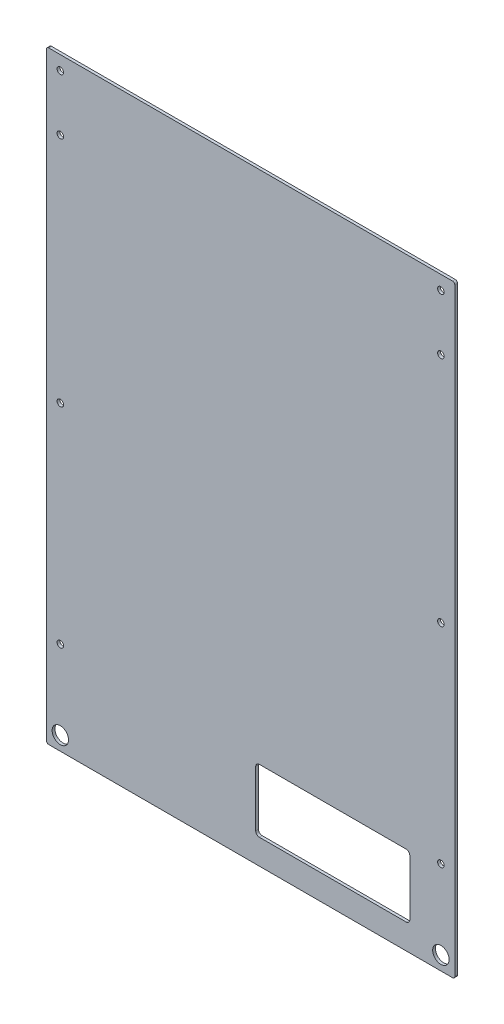
ISO-10303-21;
HEADER;
FILE_DESCRIPTION(('STEP AP214'),'2;1');
FILE_NAME('part.step','',(''),(''),'','','');
FILE_SCHEMA(('AUTOMOTIVE_DESIGN { 1 0 10303 214 1 1 1 1 }'));
ENDSEC;
DATA;
#1=APPLICATION_CONTEXT('core data for automotive mechanical design processes');
#2=APPLICATION_PROTOCOL_DEFINITION('international standard','automotive_design',2000,#1);
#3=PRODUCT_CONTEXT('',#1,'mechanical');
#4=PRODUCT('Part','Part','',(#3));
#5=PRODUCT_RELATED_PRODUCT_CATEGORY('part','',(#4));
#6=PRODUCT_DEFINITION_FORMATION('','',#4);
#7=PRODUCT_DEFINITION_CONTEXT('part definition',#1,'design');
#8=PRODUCT_DEFINITION('design','',#6,#7);
#9=PRODUCT_DEFINITION_SHAPE('','',#8);
#10=(LENGTH_UNIT() NAMED_UNIT(*) SI_UNIT(.MILLI.,.METRE.));
#11=(NAMED_UNIT(*) PLANE_ANGLE_UNIT() SI_UNIT($,.RADIAN.));
#12=(NAMED_UNIT(*) SI_UNIT($,.STERADIAN.) SOLID_ANGLE_UNIT());
#13=UNCERTAINTY_MEASURE_WITH_UNIT(LENGTH_MEASURE(1.E-05),#10,'distance_accuracy_value','');
#14=(GEOMETRIC_REPRESENTATION_CONTEXT(3) GLOBAL_UNCERTAINTY_ASSIGNED_CONTEXT((#13)) GLOBAL_UNIT_ASSIGNED_CONTEXT((#10,
#11,#12)) REPRESENTATION_CONTEXT('',''));
#15=CARTESIAN_POINT('',(0.,0.,0.));
#16=DIRECTION('',(0.,0.,1.));
#17=DIRECTION('',(1.,0.,0.));
#18=AXIS2_PLACEMENT_3D('',#15,#16,#17);
#19=CARTESIAN_POINT('',(0.,0.,3.));
#20=DIRECTION('',(0.,0.,1.));
#21=DIRECTION('',(1.,0.,0.));
#22=AXIS2_PLACEMENT_3D('',#19,#20,#21);
#23=PLANE('',#22);
#24=CARTESIAN_POINT('',(205.,-310.,3.));
#25=DIRECTION('',(0.,0.,-1.));
#26=DIRECTION('',(1.,0.,0.));
#27=AXIS2_PLACEMENT_3D('',#24,#25,#26);
#28=CIRCLE('',#27,8.85);
#29=CARTESIAN_POINT('',(196.15,-310.,3.));
#30=VERTEX_POINT('',#29);
#31=EDGE_CURVE('E321',#30,#30,#28,.T.);
#32=ORIENTED_EDGE('',*,*,#31,.T.);
#33=EDGE_LOOP('',(#32));
#34=FACE_BOUND('',#33,.T.);
#35=CARTESIAN_POINT('',(-205.,-310.,3.));
#36=DIRECTION('',(0.,0.,-1.));
#37=DIRECTION('',(1.,0.,0.));
#38=AXIS2_PLACEMENT_3D('',#35,#36,#37);
#39=CIRCLE('',#38,8.85);
#40=CARTESIAN_POINT('',(-213.85,-310.,3.));
#41=VERTEX_POINT('',#40);
#42=EDGE_CURVE('E366',#41,#41,#39,.T.);
#43=ORIENTED_EDGE('',*,*,#42,.T.);
#44=EDGE_LOOP('',(#43));
#45=FACE_BOUND('',#44,.T.);
#46=DIRECTION('',(-1.,0.,0.));
#47=VECTOR('',#46,1.);
#48=CARTESIAN_POINT('',(83.75,-298.,3.));
#49=LINE('',#48,#47);
#50=CARTESIAN_POINT('',(167.5,-298.,3.));
#51=VERTEX_POINT('',#50);
#52=CARTESIAN_POINT('',(9.5,-298.,3.));
#53=VERTEX_POINT('',#52);
#54=EDGE_CURVE('E411',#51,#53,#49,.T.);
#55=ORIENTED_EDGE('',*,*,#54,.T.);
#56=CARTESIAN_POINT('',(9.5,-294.,3.));
#57=DIRECTION('',(0.,0.,-1.));
#58=DIRECTION('',(-1.,0.,0.));
#59=AXIS2_PLACEMENT_3D('',#56,#57,#58);
#60=CIRCLE('',#59,4.);
#61=CARTESIAN_POINT('',(5.5,-294.,3.));
#62=VERTEX_POINT('',#61);
#63=EDGE_CURVE('E300',#53,#62,#60,.T.);
#64=ORIENTED_EDGE('',*,*,#63,.T.);
#65=DIRECTION('',(0.,1.,0.));
#66=VECTOR('',#65,1.);
#67=CARTESIAN_POINT('',(5.5,-147.,3.));
#68=LINE('',#67,#66);
#69=CARTESIAN_POINT('',(5.5,-234.,3.));
#70=VERTEX_POINT('',#69);
#71=EDGE_CURVE('E301',#62,#70,#68,.T.);
#72=ORIENTED_EDGE('',*,*,#71,.T.);
#73=CARTESIAN_POINT('',(9.5,-234.,3.));
#74=DIRECTION('',(0.,0.,-1.));
#75=DIRECTION('',(0.,1.,0.));
#76=AXIS2_PLACEMENT_3D('',#73,#74,#75);
#77=CIRCLE('',#76,4.);
#78=CARTESIAN_POINT('',(9.5,-230.,3.));
#79=VERTEX_POINT('',#78);
#80=EDGE_CURVE('E357',#70,#79,#77,.T.);
#81=ORIENTED_EDGE('',*,*,#80,.T.);
#82=DIRECTION('',(1.,0.,0.));
#83=VECTOR('',#82,1.);
#84=CARTESIAN_POINT('',(4.75,-230.,3.));
#85=LINE('',#84,#83);
#86=CARTESIAN_POINT('',(167.5,-230.,3.));
#87=VERTEX_POINT('',#86);
#88=EDGE_CURVE('E287',#79,#87,#85,.T.);
#89=ORIENTED_EDGE('',*,*,#88,.T.);
#90=CARTESIAN_POINT('',(167.5,-234.,3.));
#91=DIRECTION('',(0.,0.,-1.));
#92=DIRECTION('',(1.,0.,0.));
#93=AXIS2_PLACEMENT_3D('',#90,#91,#92);
#94=CIRCLE('',#93,4.);
#95=CARTESIAN_POINT('',(171.5,-234.,3.));
#96=VERTEX_POINT('',#95);
#97=EDGE_CURVE('E318',#87,#96,#94,.T.);
#98=ORIENTED_EDGE('',*,*,#97,.T.);
#99=DIRECTION('',(0.,-1.,0.));
#100=VECTOR('',#99,1.);
#101=CARTESIAN_POINT('',(171.5,-117.,3.));
#102=LINE('',#101,#100);
#103=CARTESIAN_POINT('',(171.5,-294.,3.));
#104=VERTEX_POINT('',#103);
#105=EDGE_CURVE('E449',#96,#104,#102,.T.);
#106=ORIENTED_EDGE('',*,*,#105,.T.);
#107=CARTESIAN_POINT('',(167.5,-294.,3.));
#108=DIRECTION('',(0.,0.,-1.));
#109=DIRECTION('',(0.,-1.,0.));
#110=AXIS2_PLACEMENT_3D('',#107,#108,#109);
#111=CIRCLE('',#110,4.);
#112=EDGE_CURVE('E395',#104,#51,#111,.T.);
#113=ORIENTED_EDGE('',*,*,#112,.T.);
#114=EDGE_LOOP('',(#55,#64,#72,#81,#89,#98,#106,#113));
#115=FACE_BOUND('',#114,.T.);
#116=CARTESIAN_POINT('',(205.,310.,3.));
#117=DIRECTION('',(0.,0.,-1.));
#118=DIRECTION('',(-1.,0.,0.));
#119=AXIS2_PLACEMENT_3D('',#116,#117,#118);
#120=CIRCLE('',#119,3.5);
#121=CARTESIAN_POINT('',(208.5,310.,3.));
#122=VERTEX_POINT('',#121);
#123=EDGE_CURVE('E372',#122,#122,#120,.T.);
#124=ORIENTED_EDGE('',*,*,#123,.T.);
#125=EDGE_LOOP('',(#124));
#126=FACE_BOUND('',#125,.T.);
#127=CARTESIAN_POINT('',(-205.,250.,3.));
#128=DIRECTION('',(0.,0.,-1.));
#129=DIRECTION('',(-1.,0.,0.));
#130=AXIS2_PLACEMENT_3D('',#127,#128,#129);
#131=CIRCLE('',#130,3.5);
#132=CARTESIAN_POINT('',(-201.5,250.,3.));
#133=VERTEX_POINT('',#132);
#134=EDGE_CURVE('E310',#133,#133,#131,.T.);
#135=ORIENTED_EDGE('',*,*,#134,.T.);
#136=EDGE_LOOP('',(#135));
#137=FACE_BOUND('',#136,.T.);
#138=CARTESIAN_POINT('',(205.,-225.,3.));
#139=DIRECTION('',(0.,0.,-1.));
#140=DIRECTION('',(-1.,0.,0.));
#141=AXIS2_PLACEMENT_3D('',#138,#139,#140);
#142=CIRCLE('',#141,3.5);
#143=CARTESIAN_POINT('',(208.5,-225.,3.));
#144=VERTEX_POINT('',#143);
#145=EDGE_CURVE('E356',#144,#144,#142,.T.);
#146=ORIENTED_EDGE('',*,*,#145,.T.);
#147=EDGE_LOOP('',(#146));
#148=FACE_BOUND('',#147,.T.);
#149=CARTESIAN_POINT('',(-205.,0.,3.));
#150=DIRECTION('',(0.,0.,-1.));
#151=DIRECTION('',(-1.,0.,0.));
#152=AXIS2_PLACEMENT_3D('',#149,#150,#151);
#153=CIRCLE('',#152,3.5);
#154=CARTESIAN_POINT('',(-201.5,0.,3.));
#155=VERTEX_POINT('',#154);
#156=EDGE_CURVE('E305',#155,#155,#153,.T.);
#157=ORIENTED_EDGE('',*,*,#156,.T.);
#158=EDGE_LOOP('',(#157));
#159=FACE_BOUND('',#158,.T.);
#160=CARTESIAN_POINT('',(-205.,310.,3.));
#161=DIRECTION('',(0.,0.,-1.));
#162=DIRECTION('',(-1.,0.,0.));
#163=AXIS2_PLACEMENT_3D('',#160,#161,#162);
#164=CIRCLE('',#163,3.5);
#165=CARTESIAN_POINT('',(-201.5,310.,3.));
#166=VERTEX_POINT('',#165);
#167=EDGE_CURVE('E461',#166,#166,#164,.T.);
#168=ORIENTED_EDGE('',*,*,#167,.T.);
#169=EDGE_LOOP('',(#168));
#170=FACE_BOUND('',#169,.T.);
#171=CARTESIAN_POINT('',(205.,250.,3.));
#172=DIRECTION('',(0.,0.,-1.));
#173=DIRECTION('',(-1.,0.,0.));
#174=AXIS2_PLACEMENT_3D('',#171,#172,#173);
#175=CIRCLE('',#174,3.5);
#176=CARTESIAN_POINT('',(208.5,250.,3.));
#177=VERTEX_POINT('',#176);
#178=EDGE_CURVE('E387',#177,#177,#175,.T.);
#179=ORIENTED_EDGE('',*,*,#178,.T.);
#180=EDGE_LOOP('',(#179));
#181=FACE_BOUND('',#180,.T.);
#182=CARTESIAN_POINT('',(205.,0.,3.));
#183=DIRECTION('',(0.,0.,-1.));
#184=DIRECTION('',(-1.,0.,0.));
#185=AXIS2_PLACEMENT_3D('',#182,#183,#184);
#186=CIRCLE('',#185,3.5);
#187=CARTESIAN_POINT('',(208.5,0.,3.));
#188=VERTEX_POINT('',#187);
#189=EDGE_CURVE('E317',#188,#188,#186,.T.);
#190=ORIENTED_EDGE('',*,*,#189,.T.);
#191=EDGE_LOOP('',(#190));
#192=FACE_BOUND('',#191,.T.);
#193=CARTESIAN_POINT('',(-205.,-225.,3.));
#194=DIRECTION('',(0.,0.,-1.));
#195=DIRECTION('',(-1.,0.,0.));
#196=AXIS2_PLACEMENT_3D('',#193,#194,#195);
#197=CIRCLE('',#196,3.5);
#198=CARTESIAN_POINT('',(-201.5,-225.,3.));
#199=VERTEX_POINT('',#198);
#200=EDGE_CURVE('E336',#199,#199,#197,.T.);
#201=ORIENTED_EDGE('',*,*,#200,.T.);
#202=EDGE_LOOP('',(#201));
#203=FACE_BOUND('',#202,.T.);
#204=CARTESIAN_POINT('',(217.5,322.5,3.));
#205=DIRECTION('',(0.,0.,-1.));
#206=DIRECTION('',(0.707106781186548,0.707106781186548,0.));
#207=AXIS2_PLACEMENT_3D('',#204,#205,#206);
#208=CIRCLE('',#207,2.5);
#209=CARTESIAN_POINT('',(217.5,325.,3.));
#210=VERTEX_POINT('',#209);
#211=CARTESIAN_POINT('',(220.,322.5,3.));
#212=VERTEX_POINT('',#211);
#213=EDGE_CURVE('E390',#210,#212,#208,.T.);
#214=ORIENTED_EDGE('',*,*,#213,.F.);
#215=DIRECTION('',(-1.,0.,0.));
#216=VECTOR('',#215,1.);
#217=CARTESIAN_POINT('',(-220.,325.,3.));
#218=LINE('',#217,#216);
#219=CARTESIAN_POINT('',(-217.5,325.,3.));
#220=VERTEX_POINT('',#219);
#221=EDGE_CURVE('E426',#210,#220,#218,.T.);
#222=ORIENTED_EDGE('',*,*,#221,.T.);
#223=CARTESIAN_POINT('',(-217.5,322.5,3.));
#224=DIRECTION('',(0.,0.,-1.));
#225=DIRECTION('',(-0.707106781186548,0.707106781186548,0.));
#226=AXIS2_PLACEMENT_3D('',#223,#224,#225);
#227=CIRCLE('',#226,2.5);
#228=CARTESIAN_POINT('',(-220.,322.5,3.));
#229=VERTEX_POINT('',#228);
#230=EDGE_CURVE('E247',#229,#220,#227,.T.);
#231=ORIENTED_EDGE('',*,*,#230,.F.);
#232=DIRECTION('',(0.,-1.,0.));
#233=VECTOR('',#232,1.);
#234=CARTESIAN_POINT('',(-220.,-325.,3.));
#235=LINE('',#234,#233);
#236=CARTESIAN_POINT('',(-220.,-322.5,3.));
#237=VERTEX_POINT('',#236);
#238=EDGE_CURVE('E242',#229,#237,#235,.T.);
#239=ORIENTED_EDGE('',*,*,#238,.T.);
#240=CARTESIAN_POINT('',(-217.5,-322.5,3.));
#241=DIRECTION('',(0.,0.,-1.));
#242=DIRECTION('',(-0.707106781186548,-0.707106781186548,0.));
#243=AXIS2_PLACEMENT_3D('',#240,#241,#242);
#244=CIRCLE('',#243,2.5);
#245=CARTESIAN_POINT('',(-217.5,-325.,3.));
#246=VERTEX_POINT('',#245);
#247=EDGE_CURVE('E363',#246,#237,#244,.T.);
#248=ORIENTED_EDGE('',*,*,#247,.F.);
#249=DIRECTION('',(1.,0.,0.));
#250=VECTOR('',#249,1.);
#251=CARTESIAN_POINT('',(220.,-325.,3.));
#252=LINE('',#251,#250);
#253=CARTESIAN_POINT('',(217.5,-325.,3.));
#254=VERTEX_POINT('',#253);
#255=EDGE_CURVE('E394',#246,#254,#252,.T.);
#256=ORIENTED_EDGE('',*,*,#255,.T.);
#257=CARTESIAN_POINT('',(217.5,-322.5,3.));
#258=DIRECTION('',(0.,0.,-1.));
#259=DIRECTION('',(0.707106781186548,-0.707106781186548,0.));
#260=AXIS2_PLACEMENT_3D('',#257,#258,#259);
#261=CIRCLE('',#260,2.5);
#262=CARTESIAN_POINT('',(220.,-322.5,3.));
#263=VERTEX_POINT('',#262);
#264=EDGE_CURVE('E286',#263,#254,#261,.T.);
#265=ORIENTED_EDGE('',*,*,#264,.F.);
#266=DIRECTION('',(0.,1.,0.));
#267=VECTOR('',#266,1.);
#268=CARTESIAN_POINT('',(220.,325.,3.));
#269=LINE('',#268,#267);
#270=EDGE_CURVE('E10',#263,#212,#269,.T.);
#271=ORIENTED_EDGE('',*,*,#270,.T.);
#272=EDGE_LOOP('',(#214,#222,#231,#239,#248,#256,#265,#271));
#273=FACE_BOUND('',#272,.T.);
#274=ADVANCED_FACE('F15',(#34,#45,#115,#126,#137,#148,#159,#170,#181,#192,#203,#273),#23,.T.);
#275=CARTESIAN_POINT('',(220.,-325.,0.));
#276=DIRECTION('',(1.,0.,0.));
#277=DIRECTION('',(0.,1.,0.));
#278=AXIS2_PLACEMENT_3D('',#275,#276,#277);
#279=PLANE('',#278);
#280=DIRECTION('',(0.,0.,-1.));
#281=VECTOR('',#280,1.);
#282=CARTESIAN_POINT('',(220.,322.5,0.));
#283=LINE('',#282,#281);
#284=CARTESIAN_POINT('',(220.,322.5,0.));
#285=VERTEX_POINT('',#284);
#286=EDGE_CURVE('E425',#212,#285,#283,.T.);
#287=ORIENTED_EDGE('',*,*,#286,.F.);
#288=ORIENTED_EDGE('',*,*,#270,.F.);
#289=DIRECTION('',(0.,0.,1.));
#290=VECTOR('',#289,1.);
#291=CARTESIAN_POINT('',(220.,-322.5,0.));
#292=LINE('',#291,#290);
#293=CARTESIAN_POINT('',(220.,-322.5,0.));
#294=VERTEX_POINT('',#293);
#295=EDGE_CURVE('E282',#294,#263,#292,.T.);
#296=ORIENTED_EDGE('',*,*,#295,.F.);
#297=DIRECTION('',(0.,-1.,0.));
#298=VECTOR('',#297,1.);
#299=CARTESIAN_POINT('',(220.,325.,0.));
#300=LINE('',#299,#298);
#301=EDGE_CURVE('E430',#285,#294,#300,.T.);
#302=ORIENTED_EDGE('',*,*,#301,.F.);
#303=EDGE_LOOP('',(#287,#288,#296,#302));
#304=FACE_BOUND('',#303,.T.);
#305=ADVANCED_FACE('F761',(#304),#279,.T.);
#306=CARTESIAN_POINT('',(-205.,-310.,0.));
#307=DIRECTION('',(0.,0.,1.));
#308=DIRECTION('',(1.,0.,0.));
#309=AXIS2_PLACEMENT_3D('',#306,#307,#308);
#310=CYLINDRICAL_SURFACE('',#309,8.85);
#311=ORIENTED_EDGE('',*,*,#42,.F.);
#312=DIRECTION('',(0.,0.,-1.));
#313=VECTOR('',#312,1.);
#314=CARTESIAN_POINT('',(-213.85,-310.,0.));
#315=LINE('',#314,#313);
#316=CARTESIAN_POINT('',(-213.85,-310.,0.));
#317=VERTEX_POINT('',#316);
#318=EDGE_CURVE('E26',#41,#317,#315,.T.);
#319=ORIENTED_EDGE('',*,*,#318,.T.);
#320=CARTESIAN_POINT('',(-205.,-310.,0.));
#321=DIRECTION('',(0.,0.,-1.));
#322=DIRECTION('',(1.,0.,0.));
#323=AXIS2_PLACEMENT_3D('',#320,#321,#322);
#324=CIRCLE('',#323,8.85);
#325=EDGE_CURVE('E376',#317,#317,#324,.T.);
#326=ORIENTED_EDGE('',*,*,#325,.T.);
#327=ORIENTED_EDGE('',*,*,#318,.F.);
#328=EDGE_LOOP('',(#311,#319,#326,#327));
#329=FACE_BOUND('',#328,.T.);
#330=ADVANCED_FACE('F726',(#329),#310,.F.);
#331=CARTESIAN_POINT('',(205.,-310.,0.));
#332=DIRECTION('',(0.,0.,1.));
#333=DIRECTION('',(1.,0.,0.));
#334=AXIS2_PLACEMENT_3D('',#331,#332,#333);
#335=CYLINDRICAL_SURFACE('',#334,8.85);
#336=ORIENTED_EDGE('',*,*,#31,.F.);
#337=DIRECTION('',(0.,0.,-1.));
#338=VECTOR('',#337,1.);
#339=CARTESIAN_POINT('',(196.15,-310.,0.));
#340=LINE('',#339,#338);
#341=CARTESIAN_POINT('',(196.15,-310.,0.));
#342=VERTEX_POINT('',#341);
#343=EDGE_CURVE('E421',#30,#342,#340,.T.);
#344=ORIENTED_EDGE('',*,*,#343,.T.);
#345=CARTESIAN_POINT('',(205.,-310.,0.));
#346=DIRECTION('',(0.,0.,-1.));
#347=DIRECTION('',(1.,0.,0.));
#348=AXIS2_PLACEMENT_3D('',#345,#346,#347);
#349=CIRCLE('',#348,8.85);
#350=EDGE_CURVE('E330',#342,#342,#349,.T.);
#351=ORIENTED_EDGE('',*,*,#350,.T.);
#352=ORIENTED_EDGE('',*,*,#343,.F.);
#353=EDGE_LOOP('',(#336,#344,#351,#352));
#354=FACE_BOUND('',#353,.T.);
#355=ADVANCED_FACE('F721',(#354),#335,.F.);
#356=CARTESIAN_POINT('',(167.5,-234.,3.));
#357=DIRECTION('',(0.,0.,-1.));
#358=DIRECTION('',(1.,0.,0.));
#359=AXIS2_PLACEMENT_3D('',#356,#357,#358);
#360=CYLINDRICAL_SURFACE('',#359,4.);
#361=CARTESIAN_POINT('',(167.5,-234.,0.));
#362=DIRECTION('',(0.,0.,1.));
#363=DIRECTION('',(1.,0.,0.));
#364=AXIS2_PLACEMENT_3D('',#361,#362,#363);
#365=CIRCLE('',#364,4.);
#366=CARTESIAN_POINT('',(171.5,-234.,0.));
#367=VERTEX_POINT('',#366);
#368=CARTESIAN_POINT('',(167.5,-230.,0.));
#369=VERTEX_POINT('',#368);
#370=EDGE_CURVE('E295',#367,#369,#365,.T.);
#371=ORIENTED_EDGE('',*,*,#370,.F.);
#372=DIRECTION('',(0.,0.,-1.));
#373=VECTOR('',#372,1.);
#374=CARTESIAN_POINT('',(171.5,-234.,3.));
#375=LINE('',#374,#373);
#376=EDGE_CURVE('E211',#96,#367,#375,.T.);
#377=ORIENTED_EDGE('',*,*,#376,.F.);
#378=ORIENTED_EDGE('',*,*,#97,.F.);
#379=DIRECTION('',(0.,0.,-1.));
#380=VECTOR('',#379,1.);
#381=CARTESIAN_POINT('',(167.5,-230.,3.));
#382=LINE('',#381,#380);
#383=EDGE_CURVE('E200',#87,#369,#382,.T.);
#384=ORIENTED_EDGE('',*,*,#383,.T.);
#385=EDGE_LOOP('',(#371,#377,#378,#384));
#386=FACE_BOUND('',#385,.T.);
#387=ADVANCED_FACE('F725',(#386),#360,.F.);
#388=CARTESIAN_POINT('',(171.5,-234.,3.));
#389=DIRECTION('',(1.,0.,0.));
#390=DIRECTION('',(0.,1.,0.));
#391=AXIS2_PLACEMENT_3D('',#388,#389,#390);
#392=PLANE('',#391);
#393=DIRECTION('',(0.,1.,0.));
#394=VECTOR('',#393,1.);
#395=CARTESIAN_POINT('',(171.5,-117.,0.));
#396=LINE('',#395,#394);
#397=CARTESIAN_POINT('',(171.5,-294.,0.));
#398=VERTEX_POINT('',#397);
#399=EDGE_CURVE('E291',#398,#367,#396,.T.);
#400=ORIENTED_EDGE('',*,*,#399,.F.);
#401=DIRECTION('',(0.,0.,-1.));
#402=VECTOR('',#401,1.);
#403=CARTESIAN_POINT('',(171.5,-294.,3.));
#404=LINE('',#403,#402);
#405=EDGE_CURVE('E398',#104,#398,#404,.T.);
#406=ORIENTED_EDGE('',*,*,#405,.F.);
#407=ORIENTED_EDGE('',*,*,#105,.F.);
#408=ORIENTED_EDGE('',*,*,#376,.T.);
#409=EDGE_LOOP('',(#400,#406,#407,#408));
#410=FACE_BOUND('',#409,.T.);
#411=ADVANCED_FACE('F778',(#410),#392,.F.);
#412=CARTESIAN_POINT('',(167.5,-294.,3.));
#413=DIRECTION('',(0.,0.,-1.));
#414=DIRECTION('',(0.,-1.,0.));
#415=AXIS2_PLACEMENT_3D('',#412,#413,#414);
#416=CYLINDRICAL_SURFACE('',#415,4.);
#417=CARTESIAN_POINT('',(167.5,-294.,0.));
#418=DIRECTION('',(0.,0.,1.));
#419=DIRECTION('',(0.,-1.,0.));
#420=AXIS2_PLACEMENT_3D('',#417,#418,#419);
#421=CIRCLE('',#420,4.);
#422=CARTESIAN_POINT('',(167.5,-298.,0.));
#423=VERTEX_POINT('',#422);
#424=EDGE_CURVE('E296',#423,#398,#421,.T.);
#425=ORIENTED_EDGE('',*,*,#424,.F.);
#426=DIRECTION('',(0.,0.,-1.));
#427=VECTOR('',#426,1.);
#428=CARTESIAN_POINT('',(167.5,-298.,3.));
#429=LINE('',#428,#427);
#430=EDGE_CURVE('E399',#51,#423,#429,.T.);
#431=ORIENTED_EDGE('',*,*,#430,.F.);
#432=ORIENTED_EDGE('',*,*,#112,.F.);
#433=ORIENTED_EDGE('',*,*,#405,.T.);
#434=EDGE_LOOP('',(#425,#431,#432,#433));
#435=FACE_BOUND('',#434,.T.);
#436=ADVANCED_FACE('F786',(#435),#416,.F.);
#437=CARTESIAN_POINT('',(167.5,-298.,3.));
#438=DIRECTION('',(0.,-1.,0.));
#439=DIRECTION('',(0.,0.,-1.));
#440=AXIS2_PLACEMENT_3D('',#437,#438,#439);
#441=PLANE('',#440);
#442=DIRECTION('',(1.,0.,0.));
#443=VECTOR('',#442,1.);
#444=CARTESIAN_POINT('',(83.75,-298.,0.));
#445=LINE('',#444,#443);
#446=CARTESIAN_POINT('',(9.5,-298.,0.));
#447=VERTEX_POINT('',#446);
#448=EDGE_CURVE('E257',#447,#423,#445,.T.);
#449=ORIENTED_EDGE('',*,*,#448,.F.);
#450=DIRECTION('',(0.,0.,-1.));
#451=VECTOR('',#450,1.);
#452=CARTESIAN_POINT('',(9.5,-298.,3.));
#453=LINE('',#452,#451);
#454=EDGE_CURVE('E408',#53,#447,#453,.T.);
#455=ORIENTED_EDGE('',*,*,#454,.F.);
#456=ORIENTED_EDGE('',*,*,#54,.F.);
#457=ORIENTED_EDGE('',*,*,#430,.T.);
#458=EDGE_LOOP('',(#449,#455,#456,#457));
#459=FACE_BOUND('',#458,.T.);
#460=ADVANCED_FACE('F822',(#459),#441,.F.);
#461=CARTESIAN_POINT('',(9.5,-294.,3.));
#462=DIRECTION('',(0.,0.,-1.));
#463=DIRECTION('',(-1.,0.,0.));
#464=AXIS2_PLACEMENT_3D('',#461,#462,#463);
#465=CYLINDRICAL_SURFACE('',#464,4.);
#466=CARTESIAN_POINT('',(9.5,-294.,0.));
#467=DIRECTION('',(0.,0.,1.));
#468=DIRECTION('',(-1.,0.,0.));
#469=AXIS2_PLACEMENT_3D('',#466,#467,#468);
#470=CIRCLE('',#469,4.);
#471=CARTESIAN_POINT('',(5.5,-294.,0.));
#472=VERTEX_POINT('',#471);
#473=EDGE_CURVE('E350',#472,#447,#470,.T.);
#474=ORIENTED_EDGE('',*,*,#473,.F.);
#475=DIRECTION('',(0.,0.,-1.));
#476=VECTOR('',#475,1.);
#477=CARTESIAN_POINT('',(5.5,-294.,3.));
#478=LINE('',#477,#476);
#479=EDGE_CURVE('E297',#62,#472,#478,.T.);
#480=ORIENTED_EDGE('',*,*,#479,.F.);
#481=ORIENTED_EDGE('',*,*,#63,.F.);
#482=ORIENTED_EDGE('',*,*,#454,.T.);
#483=EDGE_LOOP('',(#474,#480,#481,#482));
#484=FACE_BOUND('',#483,.T.);
#485=ADVANCED_FACE('F752',(#484),#465,.F.);
#486=CARTESIAN_POINT('',(5.5,-294.,3.));
#487=DIRECTION('',(-1.,0.,0.));
#488=DIRECTION('',(0.,0.,1.));
#489=AXIS2_PLACEMENT_3D('',#486,#487,#488);
#490=PLANE('',#489);
#491=DIRECTION('',(0.,-1.,0.));
#492=VECTOR('',#491,1.);
#493=CARTESIAN_POINT('',(5.5,-147.,0.));
#494=LINE('',#493,#492);
#495=CARTESIAN_POINT('',(5.5,-234.,0.));
#496=VERTEX_POINT('',#495);
#497=EDGE_CURVE('E347',#496,#472,#494,.T.);
#498=ORIENTED_EDGE('',*,*,#497,.F.);
#499=DIRECTION('',(0.,0.,-1.));
#500=VECTOR('',#499,1.);
#501=CARTESIAN_POINT('',(5.5,-234.,3.));
#502=LINE('',#501,#500);
#503=EDGE_CURVE('E360',#70,#496,#502,.T.);
#504=ORIENTED_EDGE('',*,*,#503,.F.);
#505=ORIENTED_EDGE('',*,*,#71,.F.);
#506=ORIENTED_EDGE('',*,*,#479,.T.);
#507=EDGE_LOOP('',(#498,#504,#505,#506));
#508=FACE_BOUND('',#507,.T.);
#509=ADVANCED_FACE('F734',(#508),#490,.F.);
#510=CARTESIAN_POINT('',(9.5,-234.,3.));
#511=DIRECTION('',(0.,0.,-1.));
#512=DIRECTION('',(0.,1.,0.));
#513=AXIS2_PLACEMENT_3D('',#510,#511,#512);
#514=CYLINDRICAL_SURFACE('',#513,4.);
#515=CARTESIAN_POINT('',(9.5,-234.,0.));
#516=DIRECTION('',(0.,0.,1.));
#517=DIRECTION('',(0.,1.,0.));
#518=AXIS2_PLACEMENT_3D('',#515,#516,#517);
#519=CIRCLE('',#518,4.);
#520=CARTESIAN_POINT('',(9.5,-230.,0.));
#521=VERTEX_POINT('',#520);
#522=EDGE_CURVE('E351',#521,#496,#519,.T.);
#523=ORIENTED_EDGE('',*,*,#522,.F.);
#524=DIRECTION('',(0.,0.,-1.));
#525=VECTOR('',#524,1.);
#526=CARTESIAN_POINT('',(9.5,-230.,3.));
#527=LINE('',#526,#525);
#528=EDGE_CURVE('E192',#79,#521,#527,.T.);
#529=ORIENTED_EDGE('',*,*,#528,.F.);
#530=ORIENTED_EDGE('',*,*,#80,.F.);
#531=ORIENTED_EDGE('',*,*,#503,.T.);
#532=EDGE_LOOP('',(#523,#529,#530,#531));
#533=FACE_BOUND('',#532,.T.);
#534=ADVANCED_FACE('F716',(#533),#514,.F.);
#535=CARTESIAN_POINT('',(9.5,-230.,3.));
#536=DIRECTION('',(0.,1.,0.));
#537=DIRECTION('',(1.,0.,0.));
#538=AXIS2_PLACEMENT_3D('',#535,#536,#537);
#539=PLANE('',#538);
#540=DIRECTION('',(-1.,0.,0.));
#541=VECTOR('',#540,1.);
#542=CARTESIAN_POINT('',(4.75,-230.,0.));
#543=LINE('',#542,#541);
#544=EDGE_CURVE('E280',#369,#521,#543,.T.);
#545=ORIENTED_EDGE('',*,*,#544,.F.);
#546=ORIENTED_EDGE('',*,*,#383,.F.);
#547=ORIENTED_EDGE('',*,*,#88,.F.);
#548=ORIENTED_EDGE('',*,*,#528,.T.);
#549=EDGE_LOOP('',(#545,#546,#547,#548));
#550=FACE_BOUND('',#549,.T.);
#551=ADVANCED_FACE('F17',(#550),#539,.F.);
#552=CARTESIAN_POINT('',(217.5,-322.5,0.));
#553=DIRECTION('',(0.,0.,1.));
#554=DIRECTION('',(0.707106781186548,-0.707106781186548,0.));
#555=AXIS2_PLACEMENT_3D('',#552,#553,#554);
#556=CYLINDRICAL_SURFACE('',#555,2.5);
#557=ORIENTED_EDGE('',*,*,#264,.T.);
#558=DIRECTION('',(0.,0.,-1.));
#559=VECTOR('',#558,1.);
#560=CARTESIAN_POINT('',(217.5,-325.,0.));
#561=LINE('',#560,#559);
#562=CARTESIAN_POINT('',(217.5,-325.,0.));
#563=VERTEX_POINT('',#562);
#564=EDGE_CURVE('E380',#254,#563,#561,.T.);
#565=ORIENTED_EDGE('',*,*,#564,.T.);
#566=CARTESIAN_POINT('',(217.5,-322.5,0.));
#567=DIRECTION('',(0.,0.,1.));
#568=DIRECTION('',(0.707106781186548,-0.707106781186548,0.));
#569=AXIS2_PLACEMENT_3D('',#566,#567,#568);
#570=CIRCLE('',#569,2.5);
#571=EDGE_CURVE('E276',#563,#294,#570,.T.);
#572=ORIENTED_EDGE('',*,*,#571,.T.);
#573=ORIENTED_EDGE('',*,*,#295,.T.);
#574=EDGE_LOOP('',(#557,#565,#572,#573));
#575=FACE_BOUND('',#574,.T.);
#576=ADVANCED_FACE('F715',(#575),#556,.T.);
#577=CARTESIAN_POINT('',(-220.,-325.,0.));
#578=DIRECTION('',(0.,-1.,0.));
#579=DIRECTION('',(0.,0.,-1.));
#580=AXIS2_PLACEMENT_3D('',#577,#578,#579);
#581=PLANE('',#580);
#582=DIRECTION('',(0.,0.,1.));
#583=VECTOR('',#582,1.);
#584=CARTESIAN_POINT('',(-217.5,-325.,0.));
#585=LINE('',#584,#583);
#586=CARTESIAN_POINT('',(-217.5,-325.,0.));
#587=VERTEX_POINT('',#586);
#588=EDGE_CURVE('E377',#587,#246,#585,.T.);
#589=ORIENTED_EDGE('',*,*,#588,.F.);
#590=DIRECTION('',(-1.,0.,0.));
#591=VECTOR('',#590,1.);
#592=CARTESIAN_POINT('',(220.,-325.,0.));
#593=LINE('',#592,#591);
#594=EDGE_CURVE('E269',#563,#587,#593,.T.);
#595=ORIENTED_EDGE('',*,*,#594,.F.);
#596=ORIENTED_EDGE('',*,*,#564,.F.);
#597=ORIENTED_EDGE('',*,*,#255,.F.);
#598=EDGE_LOOP('',(#589,#595,#596,#597));
#599=FACE_BOUND('',#598,.T.);
#600=ADVANCED_FACE('F795',(#599),#581,.T.);
#601=CARTESIAN_POINT('',(-217.5,-322.5,0.));
#602=DIRECTION('',(0.,0.,1.));
#603=DIRECTION('',(-0.707106781186548,-0.707106781186548,0.));
#604=AXIS2_PLACEMENT_3D('',#601,#602,#603);
#605=CYLINDRICAL_SURFACE('',#604,2.5);
#606=ORIENTED_EDGE('',*,*,#247,.T.);
#607=DIRECTION('',(0.,0.,-1.));
#608=VECTOR('',#607,1.);
#609=CARTESIAN_POINT('',(-220.,-322.5,0.));
#610=LINE('',#609,#608);
#611=CARTESIAN_POINT('',(-220.,-322.5,0.));
#612=VERTEX_POINT('',#611);
#613=EDGE_CURVE('E246',#237,#612,#610,.T.);
#614=ORIENTED_EDGE('',*,*,#613,.T.);
#615=CARTESIAN_POINT('',(-217.5,-322.5,0.));
#616=DIRECTION('',(0.,0.,1.));
#617=DIRECTION('',(-0.707106781186548,-0.707106781186548,0.));
#618=AXIS2_PLACEMENT_3D('',#615,#616,#617);
#619=CIRCLE('',#618,2.5);
#620=EDGE_CURVE('E263',#612,#587,#619,.T.);
#621=ORIENTED_EDGE('',*,*,#620,.T.);
#622=ORIENTED_EDGE('',*,*,#588,.T.);
#623=EDGE_LOOP('',(#606,#614,#621,#622));
#624=FACE_BOUND('',#623,.T.);
#625=ADVANCED_FACE('F791',(#624),#605,.T.);
#626=CARTESIAN_POINT('',(-220.,325.,0.));
#627=DIRECTION('',(-1.,0.,0.));
#628=DIRECTION('',(0.,0.,1.));
#629=AXIS2_PLACEMENT_3D('',#626,#627,#628);
#630=PLANE('',#629);
#631=DIRECTION('',(0.,0.,1.));
#632=VECTOR('',#631,1.);
#633=CARTESIAN_POINT('',(-220.,322.5,0.));
#634=LINE('',#633,#632);
#635=CARTESIAN_POINT('',(-220.,322.5,0.));
#636=VERTEX_POINT('',#635);
#637=EDGE_CURVE('E235',#636,#229,#634,.T.);
#638=ORIENTED_EDGE('',*,*,#637,.F.);
#639=DIRECTION('',(0.,1.,0.));
#640=VECTOR('',#639,1.);
#641=CARTESIAN_POINT('',(-220.,-325.,0.));
#642=LINE('',#641,#640);
#643=EDGE_CURVE('E19',#612,#636,#642,.T.);
#644=ORIENTED_EDGE('',*,*,#643,.F.);
#645=ORIENTED_EDGE('',*,*,#613,.F.);
#646=ORIENTED_EDGE('',*,*,#238,.F.);
#647=EDGE_LOOP('',(#638,#644,#645,#646));
#648=FACE_BOUND('',#647,.T.);
#649=ADVANCED_FACE('F237',(#648),#630,.T.);
#650=CARTESIAN_POINT('',(-217.5,322.5,0.));
#651=DIRECTION('',(0.,0.,1.));
#652=DIRECTION('',(-0.707106781186548,0.707106781186548,0.));
#653=AXIS2_PLACEMENT_3D('',#650,#651,#652);
#654=CYLINDRICAL_SURFACE('',#653,2.5);
#655=ORIENTED_EDGE('',*,*,#230,.T.);
#656=DIRECTION('',(0.,0.,-1.));
#657=VECTOR('',#656,1.);
#658=CARTESIAN_POINT('',(-217.5,325.,0.));
#659=LINE('',#658,#657);
#660=CARTESIAN_POINT('',(-217.5,325.,0.));
#661=VERTEX_POINT('',#660);
#662=EDGE_CURVE('E253',#220,#661,#659,.T.);
#663=ORIENTED_EDGE('',*,*,#662,.T.);
#664=CARTESIAN_POINT('',(-217.5,322.5,0.));
#665=DIRECTION('',(0.,0.,1.));
#666=DIRECTION('',(-0.707106781186548,0.707106781186548,0.));
#667=AXIS2_PLACEMENT_3D('',#664,#665,#666);
#668=CIRCLE('',#667,2.5);
#669=EDGE_CURVE('E250',#661,#636,#668,.T.);
#670=ORIENTED_EDGE('',*,*,#669,.T.);
#671=ORIENTED_EDGE('',*,*,#637,.T.);
#672=EDGE_LOOP('',(#655,#663,#670,#671));
#673=FACE_BOUND('',#672,.T.);
#674=ADVANCED_FACE('F251',(#673),#654,.T.);
#675=CARTESIAN_POINT('',(0.,0.,0.));
#676=DIRECTION('',(0.,0.,1.));
#677=DIRECTION('',(1.,0.,0.));
#678=AXIS2_PLACEMENT_3D('',#675,#676,#677);
#679=PLANE('',#678);
#680=ORIENTED_EDGE('',*,*,#350,.F.);
#681=EDGE_LOOP('',(#680));
#682=FACE_BOUND('',#681,.T.);
#683=ORIENTED_EDGE('',*,*,#325,.F.);
#684=EDGE_LOOP('',(#683));
#685=FACE_BOUND('',#684,.T.);
#686=ORIENTED_EDGE('',*,*,#448,.T.);
#687=ORIENTED_EDGE('',*,*,#424,.T.);
#688=ORIENTED_EDGE('',*,*,#399,.T.);
#689=ORIENTED_EDGE('',*,*,#370,.T.);
#690=ORIENTED_EDGE('',*,*,#544,.T.);
#691=ORIENTED_EDGE('',*,*,#522,.T.);
#692=ORIENTED_EDGE('',*,*,#497,.T.);
#693=ORIENTED_EDGE('',*,*,#473,.T.);
#694=EDGE_LOOP('',(#686,#687,#688,#689,#690,#691,#692,#693));
#695=FACE_BOUND('',#694,.T.);
#696=CARTESIAN_POINT('',(205.,310.,0.));
#697=DIRECTION('',(0.,0.,1.));
#698=DIRECTION('',(-1.,0.,0.));
#699=AXIS2_PLACEMENT_3D('',#696,#697,#698);
#700=CIRCLE('',#699,3.5);
#701=CARTESIAN_POINT('',(208.5,310.,0.));
#702=VERTEX_POINT('',#701);
#703=EDGE_CURVE('E371',#702,#702,#700,.T.);
#704=ORIENTED_EDGE('',*,*,#703,.T.);
#705=EDGE_LOOP('',(#704));
#706=FACE_BOUND('',#705,.T.);
#707=CARTESIAN_POINT('',(-205.,250.,0.));
#708=DIRECTION('',(0.,0.,1.));
#709=DIRECTION('',(-1.,0.,0.));
#710=AXIS2_PLACEMENT_3D('',#707,#708,#709);
#711=CIRCLE('',#710,3.5);
#712=CARTESIAN_POINT('',(-201.5,250.,0.));
#713=VERTEX_POINT('',#712);
#714=EDGE_CURVE('E452',#713,#713,#711,.T.);
#715=ORIENTED_EDGE('',*,*,#714,.T.);
#716=EDGE_LOOP('',(#715));
#717=FACE_BOUND('',#716,.T.);
#718=CARTESIAN_POINT('',(205.,-225.,0.));
#719=DIRECTION('',(0.,0.,1.));
#720=DIRECTION('',(-1.,0.,0.));
#721=AXIS2_PLACEMENT_3D('',#718,#719,#720);
#722=CIRCLE('',#721,3.5);
#723=CARTESIAN_POINT('',(208.5,-225.,0.));
#724=VERTEX_POINT('',#723);
#725=EDGE_CURVE('E307',#724,#724,#722,.T.);
#726=ORIENTED_EDGE('',*,*,#725,.T.);
#727=EDGE_LOOP('',(#726));
#728=FACE_BOUND('',#727,.T.);
#729=CARTESIAN_POINT('',(-205.,0.,0.));
#730=DIRECTION('',(0.,0.,1.));
#731=DIRECTION('',(-1.,0.,0.));
#732=AXIS2_PLACEMENT_3D('',#729,#730,#731);
#733=CIRCLE('',#732,3.5);
#734=CARTESIAN_POINT('',(-201.5,0.,0.));
#735=VERTEX_POINT('',#734);
#736=EDGE_CURVE('E402',#735,#735,#733,.T.);
#737=ORIENTED_EDGE('',*,*,#736,.T.);
#738=EDGE_LOOP('',(#737));
#739=FACE_BOUND('',#738,.T.);
#740=CARTESIAN_POINT('',(-205.,310.,0.));
#741=DIRECTION('',(0.,0.,1.));
#742=DIRECTION('',(-1.,0.,0.));
#743=AXIS2_PLACEMENT_3D('',#740,#741,#742);
#744=CIRCLE('',#743,3.5);
#745=CARTESIAN_POINT('',(-201.5,310.,0.));
#746=VERTEX_POINT('',#745);
#747=EDGE_CURVE('E302',#746,#746,#744,.T.);
#748=ORIENTED_EDGE('',*,*,#747,.T.);
#749=EDGE_LOOP('',(#748));
#750=FACE_BOUND('',#749,.T.);
#751=CARTESIAN_POINT('',(205.,250.,0.));
#752=DIRECTION('',(0.,0.,1.));
#753=DIRECTION('',(-1.,0.,0.));
#754=AXIS2_PLACEMENT_3D('',#751,#752,#753);
#755=CIRCLE('',#754,3.5);
#756=CARTESIAN_POINT('',(208.5,250.,0.));
#757=VERTEX_POINT('',#756);
#758=EDGE_CURVE('E440',#757,#757,#755,.T.);
#759=ORIENTED_EDGE('',*,*,#758,.T.);
#760=EDGE_LOOP('',(#759));
#761=FACE_BOUND('',#760,.T.);
#762=CARTESIAN_POINT('',(205.,0.,0.));
#763=DIRECTION('',(0.,0.,1.));
#764=DIRECTION('',(-1.,0.,0.));
#765=AXIS2_PLACEMENT_3D('',#762,#763,#764);
#766=CIRCLE('',#765,3.5);
#767=CARTESIAN_POINT('',(208.5,0.,0.));
#768=VERTEX_POINT('',#767);
#769=EDGE_CURVE('E316',#768,#768,#766,.T.);
#770=ORIENTED_EDGE('',*,*,#769,.T.);
#771=EDGE_LOOP('',(#770));
#772=FACE_BOUND('',#771,.T.);
#773=CARTESIAN_POINT('',(-205.,-225.,0.));
#774=DIRECTION('',(0.,0.,1.));
#775=DIRECTION('',(-1.,0.,0.));
#776=AXIS2_PLACEMENT_3D('',#773,#774,#775);
#777=CIRCLE('',#776,3.5);
#778=CARTESIAN_POINT('',(-201.5,-225.,0.));
#779=VERTEX_POINT('',#778);
#780=EDGE_CURVE('E335',#779,#779,#777,.T.);
#781=ORIENTED_EDGE('',*,*,#780,.T.);
#782=EDGE_LOOP('',(#781));
#783=FACE_BOUND('',#782,.T.);
#784=CARTESIAN_POINT('',(217.5,322.5,0.));
#785=DIRECTION('',(0.,0.,1.));
#786=DIRECTION('',(0.707106781186548,0.707106781186548,0.));
#787=AXIS2_PLACEMENT_3D('',#784,#785,#786);
#788=CIRCLE('',#787,2.5);
#789=CARTESIAN_POINT('',(217.5,325.,0.));
#790=VERTEX_POINT('',#789);
#791=EDGE_CURVE('E384',#285,#790,#788,.T.);
#792=ORIENTED_EDGE('',*,*,#791,.F.);
#793=ORIENTED_EDGE('',*,*,#301,.T.);
#794=ORIENTED_EDGE('',*,*,#571,.F.);
#795=ORIENTED_EDGE('',*,*,#594,.T.);
#796=ORIENTED_EDGE('',*,*,#620,.F.);
#797=ORIENTED_EDGE('',*,*,#643,.T.);
#798=ORIENTED_EDGE('',*,*,#669,.F.);
#799=DIRECTION('',(1.,0.,0.));
#800=VECTOR('',#799,1.);
#801=CARTESIAN_POINT('',(-220.,325.,0.));
#802=LINE('',#801,#800);
#803=EDGE_CURVE('E324',#661,#790,#802,.T.);
#804=ORIENTED_EDGE('',*,*,#803,.T.);
#805=EDGE_LOOP('',(#792,#793,#794,#795,#796,#797,#798,#804));
#806=FACE_BOUND('',#805,.T.);
#807=ADVANCED_FACE('F260',(#682,#685,#695,#706,#717,#728,#739,#750,#761,#772,#783,#806),#679,.F.);
#808=CARTESIAN_POINT('',(220.,325.,0.));
#809=DIRECTION('',(0.,1.,0.));
#810=DIRECTION('',(1.,0.,0.));
#811=AXIS2_PLACEMENT_3D('',#808,#809,#810);
#812=PLANE('',#811);
#813=DIRECTION('',(0.,0.,1.));
#814=VECTOR('',#813,1.);
#815=CARTESIAN_POINT('',(217.5,325.,0.));
#816=LINE('',#815,#814);
#817=EDGE_CURVE('E327',#790,#210,#816,.T.);
#818=ORIENTED_EDGE('',*,*,#817,.F.);
#819=ORIENTED_EDGE('',*,*,#803,.F.);
#820=ORIENTED_EDGE('',*,*,#662,.F.);
#821=ORIENTED_EDGE('',*,*,#221,.F.);
#822=EDGE_LOOP('',(#818,#819,#820,#821));
#823=FACE_BOUND('',#822,.T.);
#824=ADVANCED_FACE('F743',(#823),#812,.T.);
#825=CARTESIAN_POINT('',(217.5,322.5,0.));
#826=DIRECTION('',(0.,0.,1.));
#827=DIRECTION('',(0.707106781186548,0.707106781186548,0.));
#828=AXIS2_PLACEMENT_3D('',#825,#826,#827);
#829=CYLINDRICAL_SURFACE('',#828,2.5);
#830=ORIENTED_EDGE('',*,*,#213,.T.);
#831=ORIENTED_EDGE('',*,*,#286,.T.);
#832=ORIENTED_EDGE('',*,*,#791,.T.);
#833=ORIENTED_EDGE('',*,*,#817,.T.);
#834=EDGE_LOOP('',(#830,#831,#832,#833));
#835=FACE_BOUND('',#834,.T.);
#836=ADVANCED_FACE('F850',(#835),#829,.T.);
#837=CARTESIAN_POINT('',(205.,310.,3.));
#838=DIRECTION('',(0.,0.,-1.));
#839=DIRECTION('',(-1.,0.,0.));
#840=AXIS2_PLACEMENT_3D('',#837,#838,#839);
#841=CYLINDRICAL_SURFACE('',#840,3.5);
#842=ORIENTED_EDGE('',*,*,#123,.F.);
#843=DIRECTION('',(0.,0.,-1.));
#844=VECTOR('',#843,1.);
#845=CARTESIAN_POINT('',(208.5,310.,3.));
#846=LINE('',#845,#844);
#847=EDGE_CURVE('E367',#122,#702,#846,.T.);
#848=ORIENTED_EDGE('',*,*,#847,.T.);
#849=ORIENTED_EDGE('',*,*,#703,.F.);
#850=ORIENTED_EDGE('',*,*,#847,.F.);
#851=EDGE_LOOP('',(#842,#848,#849,#850));
#852=FACE_BOUND('',#851,.T.);
#853=ADVANCED_FACE('F841',(#852),#841,.F.);
#854=CARTESIAN_POINT('',(-205.,250.,3.));
#855=DIRECTION('',(0.,0.,-1.));
#856=DIRECTION('',(-1.,0.,0.));
#857=AXIS2_PLACEMENT_3D('',#854,#855,#856);
#858=CYLINDRICAL_SURFACE('',#857,3.5);
#859=ORIENTED_EDGE('',*,*,#134,.F.);
#860=DIRECTION('',(0.,0.,-1.));
#861=VECTOR('',#860,1.);
#862=CARTESIAN_POINT('',(-201.5,250.,3.));
#863=LINE('',#862,#861);
#864=EDGE_CURVE('E343',#133,#713,#863,.T.);
#865=ORIENTED_EDGE('',*,*,#864,.T.);
#866=ORIENTED_EDGE('',*,*,#714,.F.);
#867=ORIENTED_EDGE('',*,*,#864,.F.);
#868=EDGE_LOOP('',(#859,#865,#866,#867));
#869=FACE_BOUND('',#868,.T.);
#870=ADVANCED_FACE('F805',(#869),#858,.F.);
#871=CARTESIAN_POINT('',(205.,-225.,3.));
#872=DIRECTION('',(0.,0.,-1.));
#873=DIRECTION('',(-1.,0.,0.));
#874=AXIS2_PLACEMENT_3D('',#871,#872,#873);
#875=CYLINDRICAL_SURFACE('',#874,3.5);
#876=ORIENTED_EDGE('',*,*,#145,.F.);
#877=DIRECTION('',(0.,0.,-1.));
#878=VECTOR('',#877,1.);
#879=CARTESIAN_POINT('',(208.5,-225.,3.));
#880=LINE('',#879,#878);
#881=EDGE_CURVE('E311',#144,#724,#880,.T.);
#882=ORIENTED_EDGE('',*,*,#881,.T.);
#883=ORIENTED_EDGE('',*,*,#725,.F.);
#884=ORIENTED_EDGE('',*,*,#881,.F.);
#885=EDGE_LOOP('',(#876,#882,#883,#884));
#886=FACE_BOUND('',#885,.T.);
#887=ADVANCED_FACE('F800',(#886),#875,.F.);
#888=CARTESIAN_POINT('',(-205.,0.,3.));
#889=DIRECTION('',(0.,0.,-1.));
#890=DIRECTION('',(-1.,0.,0.));
#891=AXIS2_PLACEMENT_3D('',#888,#889,#890);
#892=CYLINDRICAL_SURFACE('',#891,3.5);
#893=ORIENTED_EDGE('',*,*,#156,.F.);
#894=DIRECTION('',(0.,0.,-1.));
#895=VECTOR('',#894,1.);
#896=CARTESIAN_POINT('',(-201.5,0.,3.));
#897=LINE('',#896,#895);
#898=EDGE_CURVE('E405',#155,#735,#897,.T.);
#899=ORIENTED_EDGE('',*,*,#898,.T.);
#900=ORIENTED_EDGE('',*,*,#736,.F.);
#901=ORIENTED_EDGE('',*,*,#898,.F.);
#902=EDGE_LOOP('',(#893,#899,#900,#901));
#903=FACE_BOUND('',#902,.T.);
#904=ADVANCED_FACE('F804',(#903),#892,.F.);
#905=CARTESIAN_POINT('',(-205.,310.,3.));
#906=DIRECTION('',(0.,0.,-1.));
#907=DIRECTION('',(-1.,0.,0.));
#908=AXIS2_PLACEMENT_3D('',#905,#906,#907);
#909=CYLINDRICAL_SURFACE('',#908,3.5);
#910=ORIENTED_EDGE('',*,*,#167,.F.);
#911=DIRECTION('',(0.,0.,-1.));
#912=VECTOR('',#911,1.);
#913=CARTESIAN_POINT('',(-201.5,310.,3.));
#914=LINE('',#913,#912);
#915=EDGE_CURVE('E306',#166,#746,#914,.T.);
#916=ORIENTED_EDGE('',*,*,#915,.T.);
#917=ORIENTED_EDGE('',*,*,#747,.F.);
#918=ORIENTED_EDGE('',*,*,#915,.F.);
#919=EDGE_LOOP('',(#910,#916,#917,#918));
#920=FACE_BOUND('',#919,.T.);
#921=ADVANCED_FACE('F816',(#920),#909,.F.);
#922=CARTESIAN_POINT('',(205.,250.,3.));
#923=DIRECTION('',(0.,0.,-1.));
#924=DIRECTION('',(-1.,0.,0.));
#925=AXIS2_PLACEMENT_3D('',#922,#923,#924);
#926=CYLINDRICAL_SURFACE('',#925,3.5);
#927=ORIENTED_EDGE('',*,*,#178,.F.);
#928=DIRECTION('',(0.,0.,-1.));
#929=VECTOR('',#928,1.);
#930=CARTESIAN_POINT('',(208.5,250.,3.));
#931=LINE('',#930,#929);
#932=EDGE_CURVE('E436',#177,#757,#931,.T.);
#933=ORIENTED_EDGE('',*,*,#932,.T.);
#934=ORIENTED_EDGE('',*,*,#758,.F.);
#935=ORIENTED_EDGE('',*,*,#932,.F.);
#936=EDGE_LOOP('',(#927,#933,#934,#935));
#937=FACE_BOUND('',#936,.T.);
#938=ADVANCED_FACE('F811',(#937),#926,.F.);
#939=CARTESIAN_POINT('',(205.,0.,3.));
#940=DIRECTION('',(0.,0.,-1.));
#941=DIRECTION('',(-1.,0.,0.));
#942=AXIS2_PLACEMENT_3D('',#939,#940,#941);
#943=CYLINDRICAL_SURFACE('',#942,3.5);
#944=ORIENTED_EDGE('',*,*,#189,.F.);
#945=DIRECTION('',(0.,0.,-1.));
#946=VECTOR('',#945,1.);
#947=CARTESIAN_POINT('',(208.5,0.,3.));
#948=LINE('',#947,#946);
#949=EDGE_CURVE('E312',#188,#768,#948,.T.);
#950=ORIENTED_EDGE('',*,*,#949,.T.);
#951=ORIENTED_EDGE('',*,*,#769,.F.);
#952=ORIENTED_EDGE('',*,*,#949,.F.);
#953=EDGE_LOOP('',(#944,#950,#951,#952));
#954=FACE_BOUND('',#953,.T.);
#955=ADVANCED_FACE('F815',(#954),#943,.F.);
#956=CARTESIAN_POINT('',(-205.,-225.,3.));
#957=DIRECTION('',(0.,0.,-1.));
#958=DIRECTION('',(-1.,0.,0.));
#959=AXIS2_PLACEMENT_3D('',#956,#957,#958);
#960=CYLINDRICAL_SURFACE('',#959,3.5);
#961=ORIENTED_EDGE('',*,*,#200,.F.);
#962=DIRECTION('',(0.,0.,-1.));
#963=VECTOR('',#962,1.);
#964=CARTESIAN_POINT('',(-201.5,-225.,3.));
#965=LINE('',#964,#963);
#966=EDGE_CURVE('E331',#199,#779,#965,.T.);
#967=ORIENTED_EDGE('',*,*,#966,.T.);
#968=ORIENTED_EDGE('',*,*,#780,.F.);
#969=ORIENTED_EDGE('',*,*,#966,.F.);
#970=EDGE_LOOP('',(#961,#967,#968,#969));
#971=FACE_BOUND('',#970,.T.);
#972=ADVANCED_FACE('F883',(#971),#960,.F.);
#973=CLOSED_SHELL('',(#274,#305,#330,#355,#387,#411,#436,#460,#485,#509,#534,#551,#576,#600,
#625,#649,#674,#807,#824,#836,#853,#870,#887,#904,#921,#938,#955,#972));
#974=MANIFOLD_SOLID_BREP('B1',#973);
#975=ADVANCED_BREP_SHAPE_REPRESENTATION('',(#18,#974),#14);
#976=SHAPE_DEFINITION_REPRESENTATION(#9,#975);
ENDSEC;
END-ISO-10303-21;
